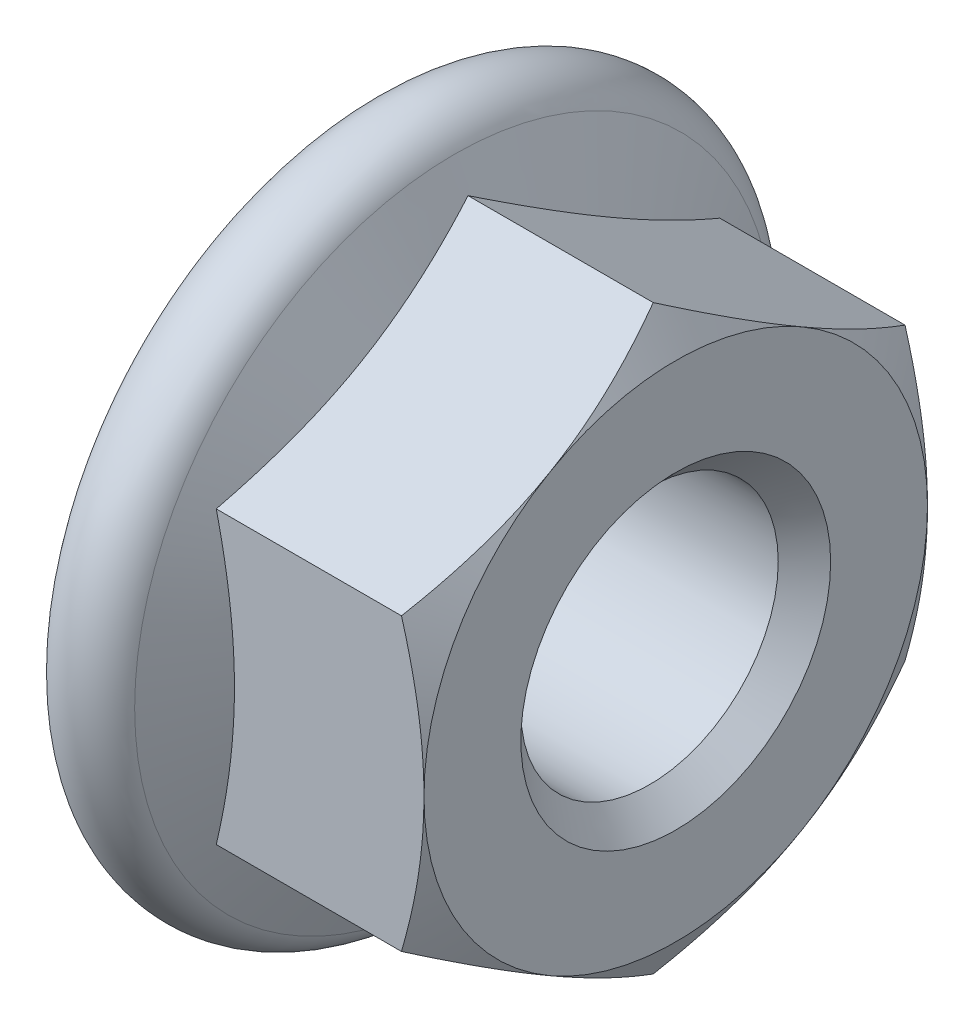
ISO-10303-21;
HEADER;
FILE_DESCRIPTION(('STEP AP214'),'2;1');
FILE_NAME('part.step','',(''),(''),'','','');
FILE_SCHEMA(('AUTOMOTIVE_DESIGN { 1 0 10303 214 1 1 1 1 }'));
ENDSEC;
DATA;
#1=APPLICATION_CONTEXT('core data for automotive mechanical design processes');
#2=APPLICATION_PROTOCOL_DEFINITION('international standard','automotive_design',2000,#1);
#3=PRODUCT_CONTEXT('',#1,'mechanical');
#4=PRODUCT('Part','Part','',(#3));
#5=PRODUCT_RELATED_PRODUCT_CATEGORY('part','',(#4));
#6=PRODUCT_DEFINITION_FORMATION('','',#4);
#7=PRODUCT_DEFINITION_CONTEXT('part definition',#1,'design');
#8=PRODUCT_DEFINITION('design','',#6,#7);
#9=PRODUCT_DEFINITION_SHAPE('','',#8);
#10=(LENGTH_UNIT() NAMED_UNIT(*) SI_UNIT(.MILLI.,.METRE.));
#11=(NAMED_UNIT(*) PLANE_ANGLE_UNIT() SI_UNIT($,.RADIAN.));
#12=(NAMED_UNIT(*) SI_UNIT($,.STERADIAN.) SOLID_ANGLE_UNIT());
#13=UNCERTAINTY_MEASURE_WITH_UNIT(LENGTH_MEASURE(1.E-05),#10,'distance_accuracy_value','');
#14=(GEOMETRIC_REPRESENTATION_CONTEXT(3) GLOBAL_UNCERTAINTY_ASSIGNED_CONTEXT((#13)) GLOBAL_UNIT_ASSIGNED_CONTEXT((#10,
#11,#12)) REPRESENTATION_CONTEXT('',''));
#15=CARTESIAN_POINT('',(0.,0.,0.));
#16=DIRECTION('',(0.,0.,1.));
#17=DIRECTION('',(1.,0.,0.));
#18=AXIS2_PLACEMENT_3D('',#15,#16,#17);
#19=CARTESIAN_POINT('',(7.6617088266467,0.,0.));
#20=DIRECTION('',(1.,0.,0.));
#21=DIRECTION('',(0.,0.,1.));
#22=AXIS2_PLACEMENT_3D('',#19,#20,#21);
#23=CONICAL_SURFACE('',#22,3.6617911733533,0.785398163397448);
#24=CARTESIAN_POINT('',(8.,0.,0.));
#25=DIRECTION('',(1.,0.,0.));
#26=DIRECTION('',(0.,0.,1.));
#27=AXIS2_PLACEMENT_3D('',#24,#25,#26);
#28=CIRCLE('',#27,4.00008234670659);
#29=CARTESIAN_POINT('',(8.,0.,-4.00008234670659));
#30=VERTEX_POINT('',#29);
#31=EDGE_CURVE('E11',#30,#30,#28,.T.);
#32=ORIENTED_EDGE('',*,*,#31,.T.);
#33=DIRECTION('',(-0.707106781186548,0.,0.707106781186547));
#34=VECTOR('',#33,1.);
#35=CARTESIAN_POINT('',(7.6617088266467,0.,-3.6617911733533));
#36=LINE('',#35,#34);
#37=CARTESIAN_POINT('',(7.32341765329341,0.,-3.3235));
#38=VERTEX_POINT('',#37);
#39=EDGE_CURVE('E26',#30,#38,#36,.T.);
#40=ORIENTED_EDGE('',*,*,#39,.T.);
#41=CARTESIAN_POINT('',(7.32341765329341,0.,0.));
#42=DIRECTION('',(-1.,0.,0.));
#43=DIRECTION('',(0.,0.,1.));
#44=AXIS2_PLACEMENT_3D('',#41,#42,#43);
#45=CIRCLE('',#44,3.3235);
#46=EDGE_CURVE('E47',#38,#38,#45,.T.);
#47=ORIENTED_EDGE('',*,*,#46,.T.);
#48=ORIENTED_EDGE('',*,*,#39,.F.);
#49=EDGE_LOOP('',(#32,#40,#47,#48));
#50=FACE_BOUND('',#49,.T.);
#51=ADVANCED_FACE('F16',(#50),#23,.F.);
#52=CARTESIAN_POINT('',(26.5484462822215,0.,0.));
#53=DIRECTION('',(-1.,0.,0.));
#54=DIRECTION('',(0.,0.,1.));
#55=AXIS2_PLACEMENT_3D('',#52,#53,#54);
#56=CYLINDRICAL_SURFACE('',#55,3.3235);
#57=CARTESIAN_POINT('',(0.390625,0.,0.));
#58=DIRECTION('',(1.,0.,0.));
#59=DIRECTION('',(0.,0.,-1.));
#60=AXIS2_PLACEMENT_3D('',#57,#58,#59);
#61=CIRCLE('',#60,3.3235);
#62=CARTESIAN_POINT('',(0.390625,0.,3.3235));
#63=VERTEX_POINT('',#62);
#64=CARTESIAN_POINT('',(0.390625,0.,-3.3235));
#65=VERTEX_POINT('',#64);
#66=EDGE_CURVE('E201',#63,#65,#61,.T.);
#67=ORIENTED_EDGE('',*,*,#66,.F.);
#68=CARTESIAN_POINT('',(0.390625,0.,0.));
#69=DIRECTION('',(1.,0.,0.));
#70=DIRECTION('',(0.,0.,-1.));
#71=AXIS2_PLACEMENT_3D('',#68,#69,#70);
#72=CIRCLE('',#71,3.3235);
#73=EDGE_CURVE('E209',#65,#63,#72,.T.);
#74=ORIENTED_EDGE('',*,*,#73,.F.);
#75=DIRECTION('',(1.,0.,0.));
#76=VECTOR('',#75,1.);
#77=CARTESIAN_POINT('',(26.5484462822215,0.,-3.3235));
#78=LINE('',#77,#76);
#79=EDGE_CURVE('E273',#65,#38,#78,.T.);
#80=ORIENTED_EDGE('',*,*,#79,.T.);
#81=ORIENTED_EDGE('',*,*,#46,.F.);
#82=ORIENTED_EDGE('',*,*,#79,.F.);
#83=EDGE_LOOP('',(#67,#74,#80,#81,#82));
#84=FACE_BOUND('',#83,.T.);
#85=ADVANCED_FACE('F461',(#84),#56,.F.);
#86=CARTESIAN_POINT('',(8.,0.,0.));
#87=DIRECTION('',(1.,0.,0.));
#88=DIRECTION('',(0.,1.,0.));
#89=AXIS2_PLACEMENT_3D('',#86,#87,#88);
#90=PLANE('',#89);
#91=CARTESIAN_POINT('',(8.,0.,0.));
#92=DIRECTION('',(1.,0.,0.));
#93=DIRECTION('',(0.,1.,0.));
#94=AXIS2_PLACEMENT_3D('',#91,#92,#93);
#95=CIRCLE('',#94,6.5);
#96=CARTESIAN_POINT('',(8.,-5.62916512459885,-3.25));
#97=VERTEX_POINT('',#96);
#98=CARTESIAN_POINT('',(8.,0.,-6.5));
#99=VERTEX_POINT('',#98);
#100=EDGE_CURVE('E279',#97,#99,#95,.T.);
#101=ORIENTED_EDGE('',*,*,#100,.T.);
#102=CARTESIAN_POINT('',(8.,0.,0.));
#103=DIRECTION('',(1.,0.,0.));
#104=DIRECTION('',(0.,1.,0.));
#105=AXIS2_PLACEMENT_3D('',#102,#103,#104);
#106=CIRCLE('',#105,6.5);
#107=CARTESIAN_POINT('',(8.,5.62916512459885,-3.25));
#108=VERTEX_POINT('',#107);
#109=EDGE_CURVE('E282',#99,#108,#106,.T.);
#110=ORIENTED_EDGE('',*,*,#109,.T.);
#111=CARTESIAN_POINT('',(8.,0.,0.));
#112=DIRECTION('',(1.,0.,0.));
#113=DIRECTION('',(0.,1.,0.));
#114=AXIS2_PLACEMENT_3D('',#111,#112,#113);
#115=CIRCLE('',#114,6.5);
#116=CARTESIAN_POINT('',(8.,5.62916512459886,3.25));
#117=VERTEX_POINT('',#116);
#118=EDGE_CURVE('E154',#108,#117,#115,.T.);
#119=ORIENTED_EDGE('',*,*,#118,.T.);
#120=CARTESIAN_POINT('',(8.,0.,0.));
#121=DIRECTION('',(1.,0.,0.));
#122=DIRECTION('',(0.,1.,0.));
#123=AXIS2_PLACEMENT_3D('',#120,#121,#122);
#124=CIRCLE('',#123,6.5);
#125=CARTESIAN_POINT('',(8.,0.,6.5));
#126=VERTEX_POINT('',#125);
#127=EDGE_CURVE('E283',#117,#126,#124,.T.);
#128=ORIENTED_EDGE('',*,*,#127,.T.);
#129=CARTESIAN_POINT('',(8.,0.,0.));
#130=DIRECTION('',(1.,0.,0.));
#131=DIRECTION('',(0.,1.,0.));
#132=AXIS2_PLACEMENT_3D('',#129,#130,#131);
#133=CIRCLE('',#132,6.5);
#134=CARTESIAN_POINT('',(8.,-5.62916512459885,3.25));
#135=VERTEX_POINT('',#134);
#136=EDGE_CURVE('E20',#126,#135,#133,.T.);
#137=ORIENTED_EDGE('',*,*,#136,.T.);
#138=CARTESIAN_POINT('',(8.,0.,0.));
#139=DIRECTION('',(1.,0.,0.));
#140=DIRECTION('',(0.,1.,0.));
#141=AXIS2_PLACEMENT_3D('',#138,#139,#140);
#142=CIRCLE('',#141,6.5);
#143=EDGE_CURVE('E327',#135,#97,#142,.T.);
#144=ORIENTED_EDGE('',*,*,#143,.T.);
#145=EDGE_LOOP('',(#101,#110,#119,#128,#137,#144));
#146=FACE_BOUND('',#145,.T.);
#147=ORIENTED_EDGE('',*,*,#31,.F.);
#148=EDGE_LOOP('',(#147));
#149=FACE_BOUND('',#148,.T.);
#150=ADVANCED_FACE('F463',(#146,#149),#90,.T.);
#151=CARTESIAN_POINT('',(0.1953125,0.,0.));
#152=DIRECTION('',(-1.,0.,0.));
#153=DIRECTION('',(0.,0.,-1.));
#154=AXIS2_PLACEMENT_3D('',#151,#152,#153);
#155=CONICAL_SURFACE('',#154,3.6617911733533,1.0471975511966);
#156=CARTESIAN_POINT('',(0.,0.,0.));
#157=DIRECTION('',(-1.,0.,0.));
#158=DIRECTION('',(0.,0.,-1.));
#159=AXIS2_PLACEMENT_3D('',#156,#157,#158);
#160=CIRCLE('',#159,4.00008234670659);
#161=CARTESIAN_POINT('',(0.,0.,4.00008234670659));
#162=VERTEX_POINT('',#161);
#163=EDGE_CURVE('E331',#162,#162,#160,.T.);
#164=ORIENTED_EDGE('',*,*,#163,.T.);
#165=DIRECTION('',(0.5,0.,-0.866025403784439));
#166=VECTOR('',#165,1.);
#167=CARTESIAN_POINT('',(0.1953125,0.,3.6617911733533));
#168=LINE('',#167,#166);
#169=EDGE_CURVE('E208',#162,#63,#168,.T.);
#170=ORIENTED_EDGE('',*,*,#169,.T.);
#171=ORIENTED_EDGE('',*,*,#66,.T.);
#172=ORIENTED_EDGE('',*,*,#73,.T.);
#173=ORIENTED_EDGE('',*,*,#169,.F.);
#174=EDGE_LOOP('',(#164,#170,#171,#172,#173));
#175=FACE_BOUND('',#174,.T.);
#176=ADVANCED_FACE('F456',(#175),#155,.F.);
#177=CARTESIAN_POINT('',(0.,3.875,0.));
#178=DIRECTION('',(-1.,0.,0.));
#179=DIRECTION('',(0.,0.,1.));
#180=AXIS2_PLACEMENT_3D('',#177,#178,#179);
#181=PLANE('',#180);
#182=CARTESIAN_POINT('',(0.,0.,0.));
#183=DIRECTION('',(1.,0.,0.));
#184=DIRECTION('',(0.,1.,0.));
#185=AXIS2_PLACEMENT_3D('',#182,#183,#184);
#186=CIRCLE('',#185,7.75);
#187=CARTESIAN_POINT('',(0.,7.75,0.));
#188=VERTEX_POINT('',#187);
#189=CARTESIAN_POINT('',(0.,0.,7.75));
#190=VERTEX_POINT('',#189);
#191=EDGE_CURVE('E199',#188,#190,#186,.T.);
#192=ORIENTED_EDGE('',*,*,#191,.F.);
#193=CARTESIAN_POINT('',(0.,0.,0.));
#194=DIRECTION('',(1.,0.,0.));
#195=DIRECTION('',(0.,1.,0.));
#196=AXIS2_PLACEMENT_3D('',#193,#194,#195);
#197=CIRCLE('',#196,7.75);
#198=EDGE_CURVE('E374',#190,#188,#197,.T.);
#199=ORIENTED_EDGE('',*,*,#198,.F.);
#200=EDGE_LOOP('',(#192,#199));
#201=FACE_BOUND('',#200,.T.);
#202=ORIENTED_EDGE('',*,*,#163,.F.);
#203=EDGE_LOOP('',(#202));
#204=FACE_BOUND('',#203,.T.);
#205=ADVANCED_FACE('F452',(#201,#204),#181,.T.);
#206=CARTESIAN_POINT('',(7.70972170819962,0.,0.));
#207=DIRECTION('',(-1.,0.,0.));
#208=DIRECTION('',(0.,1.,0.));
#209=AXIS2_PLACEMENT_3D('',#206,#207,#208);
#210=CONICAL_SURFACE('',#209,7.00277674973257,1.0471975511966);
#211=CARTESIAN_POINT('',(8.,0.,-6.5));
#212=CARTESIAN_POINT('',(8.,-1.7416697508023,-6.5));
#213=CARTESIAN_POINT('',(7.41944341639923,-3.75277674973257,-6.5));
#214=(BOUNDED_CURVE() B_SPLINE_CURVE(2,(#211,#212,#213),.UNSPECIFIED.,.F.,
.F.) B_SPLINE_CURVE_WITH_KNOTS((3,3),(0.380711317203908,0.761422634407816),
.UNSPECIFIED.) CURVE() GEOMETRIC_REPRESENTATION_ITEM() RATIONAL_B_SPLINE_CURVE((1.,
1.03795484930202,1.)) REPRESENTATION_ITEM(''));
#215=CARTESIAN_POINT('',(7.41944341639923,-3.75277674973257,-6.5));
#216=VERTEX_POINT('',#215);
#217=EDGE_CURVE('E187',#99,#216,#214,.T.);
#218=ORIENTED_EDGE('',*,*,#217,.F.);
#219=ORIENTED_EDGE('',*,*,#100,.F.);
#220=CARTESIAN_POINT('',(7.41944341639923,-3.75277674973257,-6.5));
#221=CARTESIAN_POINT('',(8.,-4.75833024919772,-4.75833024919771));
#222=CARTESIAN_POINT('',(8.,-5.62916512459885,-3.25));
#223=(BOUNDED_CURVE() B_SPLINE_CURVE(2,(#220,#221,#222),.UNSPECIFIED.,.F.,
.F.) B_SPLINE_CURVE_WITH_KNOTS((3,3),(0.,0.380711317203909),
.UNSPECIFIED.) CURVE() GEOMETRIC_REPRESENTATION_ITEM() RATIONAL_B_SPLINE_CURVE((1.,
1.03795484930205,1.)) REPRESENTATION_ITEM(''));
#224=EDGE_CURVE('E256',#216,#97,#223,.T.);
#225=ORIENTED_EDGE('',*,*,#224,.F.);
#226=EDGE_LOOP('',(#218,#219,#225));
#227=FACE_BOUND('',#226,.T.);
#228=ADVANCED_FACE('F455',(#227),#210,.T.);
#229=CARTESIAN_POINT('',(7.70972170819962,0.,0.));
#230=DIRECTION('',(-1.,0.,0.));
#231=DIRECTION('',(0.,-1.,0.));
#232=AXIS2_PLACEMENT_3D('',#229,#230,#231);
#233=CONICAL_SURFACE('',#232,7.00277674973257,1.0471975511966);
#234=CARTESIAN_POINT('',(7.41944341639923,-7.50555349946513,0.));
#235=CARTESIAN_POINT('',(8.,-6.5,1.74166975080232));
#236=CARTESIAN_POINT('',(8.,-5.62916512459885,3.25));
#237=(BOUNDED_CURVE() B_SPLINE_CURVE(2,(#234,#235,#236),.UNSPECIFIED.,.F.,
.F.) B_SPLINE_CURVE_WITH_KNOTS((3,3),(0.,0.380711317203908),
.UNSPECIFIED.) CURVE() GEOMETRIC_REPRESENTATION_ITEM() RATIONAL_B_SPLINE_CURVE((1.,
1.03795484930205,1.)) REPRESENTATION_ITEM(''));
#238=CARTESIAN_POINT('',(7.41944341639923,-7.50555349946513,0.));
#239=VERTEX_POINT('',#238);
#240=EDGE_CURVE('E362',#239,#135,#237,.T.);
#241=ORIENTED_EDGE('',*,*,#240,.F.);
#242=CARTESIAN_POINT('',(8.,-5.62916512459885,-3.25));
#243=CARTESIAN_POINT('',(8.,-6.50000000000001,-1.74166975080229));
#244=CARTESIAN_POINT('',(7.41944341639923,-7.50555349946514,0.));
#245=(BOUNDED_CURVE() B_SPLINE_CURVE(2,(#242,#243,#244),.UNSPECIFIED.,.F.,
.F.) B_SPLINE_CURVE_WITH_KNOTS((3,3),(0.380711317203909,0.761422634407818),
.UNSPECIFIED.) CURVE() GEOMETRIC_REPRESENTATION_ITEM() RATIONAL_B_SPLINE_CURVE((1.,
1.03795484930203,1.)) REPRESENTATION_ITEM(''));
#246=EDGE_CURVE('E317',#97,#239,#245,.T.);
#247=ORIENTED_EDGE('',*,*,#246,.F.);
#248=ORIENTED_EDGE('',*,*,#143,.F.);
#249=EDGE_LOOP('',(#241,#247,#248));
#250=FACE_BOUND('',#249,.T.);
#251=ADVANCED_FACE('F18',(#250),#233,.T.);
#252=CARTESIAN_POINT('',(7.70972170819962,0.,0.));
#253=DIRECTION('',(-1.,0.,0.));
#254=DIRECTION('',(0.,1.,0.));
#255=AXIS2_PLACEMENT_3D('',#252,#253,#254);
#256=CONICAL_SURFACE('',#255,7.00277674973257,1.0471975511966);
#257=CARTESIAN_POINT('',(8.,5.62916512459885,-3.25));
#258=CARTESIAN_POINT('',(8.,4.7583302491977,-4.7583302491977));
#259=CARTESIAN_POINT('',(7.41944341639923,3.75277674973257,-6.5));
#260=(BOUNDED_CURVE() B_SPLINE_CURVE(2,(#257,#258,#259),.UNSPECIFIED.,.F.,
.F.) B_SPLINE_CURVE_WITH_KNOTS((3,3),(0.380711317203908,0.761422634407815),
.UNSPECIFIED.) CURVE() GEOMETRIC_REPRESENTATION_ITEM() RATIONAL_B_SPLINE_CURVE((1.,
1.03795484930204,1.)) REPRESENTATION_ITEM(''));
#261=CARTESIAN_POINT('',(7.41944341639923,3.75277674973257,-6.5));
#262=VERTEX_POINT('',#261);
#263=EDGE_CURVE('E161',#108,#262,#260,.T.);
#264=ORIENTED_EDGE('',*,*,#263,.F.);
#265=ORIENTED_EDGE('',*,*,#109,.F.);
#266=CARTESIAN_POINT('',(7.41944341639923,3.75277674973257,-6.5));
#267=CARTESIAN_POINT('',(8.,1.7416697508023,-6.5));
#268=CARTESIAN_POINT('',(8.,0.,-6.5));
#269=(BOUNDED_CURVE() B_SPLINE_CURVE(2,(#266,#267,#268),.UNSPECIFIED.,.F.,
.F.) B_SPLINE_CURVE_WITH_KNOTS((3,3),(0.,0.380711317203908),
.UNSPECIFIED.) CURVE() GEOMETRIC_REPRESENTATION_ITEM() RATIONAL_B_SPLINE_CURVE((1.,
1.03795484930202,1.)) REPRESENTATION_ITEM(''));
#270=EDGE_CURVE('E178',#262,#99,#269,.T.);
#271=ORIENTED_EDGE('',*,*,#270,.F.);
#272=EDGE_LOOP('',(#264,#265,#271));
#273=FACE_BOUND('',#272,.T.);
#274=ADVANCED_FACE('F487',(#273),#256,.T.);
#275=CARTESIAN_POINT('',(7.70972170819962,0.,0.));
#276=DIRECTION('',(-1.,0.,0.));
#277=DIRECTION('',(0.,1.,0.));
#278=AXIS2_PLACEMENT_3D('',#275,#276,#277);
#279=CONICAL_SURFACE('',#278,7.00277674973257,1.0471975511966);
#280=CARTESIAN_POINT('',(7.41944341639923,-3.75277674973256,6.5));
#281=CARTESIAN_POINT('',(8.,-1.74166975080229,6.50000000000001));
#282=CARTESIAN_POINT('',(8.,0.,6.5));
#283=(BOUNDED_CURVE() B_SPLINE_CURVE(2,(#280,#281,#282),.UNSPECIFIED.,.F.,
.F.) B_SPLINE_CURVE_WITH_KNOTS((3,3),(0.,0.380711317203908),
.UNSPECIFIED.) CURVE() GEOMETRIC_REPRESENTATION_ITEM() RATIONAL_B_SPLINE_CURVE((1.,
1.03795484930204,1.)) REPRESENTATION_ITEM(''));
#284=CARTESIAN_POINT('',(7.41944341639923,-3.75277674973255,6.5));
#285=VERTEX_POINT('',#284);
#286=EDGE_CURVE('E210',#285,#126,#283,.T.);
#287=ORIENTED_EDGE('',*,*,#286,.F.);
#288=CARTESIAN_POINT('',(8.,-5.62916512459885,3.25));
#289=CARTESIAN_POINT('',(8.,-4.7583302491977,4.7583302491977));
#290=CARTESIAN_POINT('',(7.41944341639923,-3.75277674973256,6.5));
#291=(BOUNDED_CURVE() B_SPLINE_CURVE(2,(#288,#289,#290),.UNSPECIFIED.,.F.,
.F.) B_SPLINE_CURVE_WITH_KNOTS((3,3),(0.380711317203908,0.761422634407816),
.UNSPECIFIED.) CURVE() GEOMETRIC_REPRESENTATION_ITEM() RATIONAL_B_SPLINE_CURVE((1.,
1.03795484930204,1.)) REPRESENTATION_ITEM(''));
#292=EDGE_CURVE('E216',#135,#285,#291,.T.);
#293=ORIENTED_EDGE('',*,*,#292,.F.);
#294=ORIENTED_EDGE('',*,*,#136,.F.);
#295=EDGE_LOOP('',(#287,#293,#294));
#296=FACE_BOUND('',#295,.T.);
#297=ADVANCED_FACE('F489',(#296),#279,.T.);
#298=CARTESIAN_POINT('',(7.70972170819962,0.,0.));
#299=DIRECTION('',(-1.,0.,0.));
#300=DIRECTION('',(0.,1.,0.));
#301=AXIS2_PLACEMENT_3D('',#298,#299,#300);
#302=CONICAL_SURFACE('',#301,7.00277674973257,1.0471975511966);
#303=CARTESIAN_POINT('',(8.,5.62916512459886,3.25));
#304=CARTESIAN_POINT('',(8.,6.50000000000002,1.74166975080229));
#305=CARTESIAN_POINT('',(7.41944341639923,7.50555349946514,0.));
#306=(BOUNDED_CURVE() B_SPLINE_CURVE(2,(#303,#304,#305),.UNSPECIFIED.,.F.,
.F.) B_SPLINE_CURVE_WITH_KNOTS((3,3),(0.380711317203908,0.761422634407816),
.UNSPECIFIED.) CURVE() GEOMETRIC_REPRESENTATION_ITEM() RATIONAL_B_SPLINE_CURVE((1.,
1.03795484930203,1.)) REPRESENTATION_ITEM(''));
#307=CARTESIAN_POINT('',(7.41944341639923,7.50555349946513,0.));
#308=VERTEX_POINT('',#307);
#309=EDGE_CURVE('E151',#117,#308,#306,.T.);
#310=ORIENTED_EDGE('',*,*,#309,.F.);
#311=ORIENTED_EDGE('',*,*,#118,.F.);
#312=CARTESIAN_POINT('',(7.41944341639923,7.50555349946513,0.));
#313=CARTESIAN_POINT('',(8.,6.50000000000001,-1.7416697508023));
#314=CARTESIAN_POINT('',(8.,5.62916512459885,-3.25));
#315=(BOUNDED_CURVE() B_SPLINE_CURVE(2,(#312,#313,#314),.UNSPECIFIED.,.F.,
.F.) B_SPLINE_CURVE_WITH_KNOTS((3,3),(0.,0.380711317203908),
.UNSPECIFIED.) CURVE() GEOMETRIC_REPRESENTATION_ITEM() RATIONAL_B_SPLINE_CURVE((1.,
1.03795484930203,1.)) REPRESENTATION_ITEM(''));
#316=EDGE_CURVE('E148',#308,#108,#315,.T.);
#317=ORIENTED_EDGE('',*,*,#316,.F.);
#318=EDGE_LOOP('',(#310,#311,#317));
#319=FACE_BOUND('',#318,.T.);
#320=ADVANCED_FACE('F150',(#319),#302,.T.);
#321=CARTESIAN_POINT('',(7.70972170819962,0.,0.));
#322=DIRECTION('',(-1.,0.,0.));
#323=DIRECTION('',(0.,1.,0.));
#324=AXIS2_PLACEMENT_3D('',#321,#322,#323);
#325=CONICAL_SURFACE('',#324,7.00277674973257,1.0471975511966);
#326=CARTESIAN_POINT('',(7.41944341639923,3.75277674973258,6.5));
#327=CARTESIAN_POINT('',(8.,4.75833024919772,4.75833024919771));
#328=CARTESIAN_POINT('',(8.,5.62916512459886,3.25));
#329=(BOUNDED_CURVE() B_SPLINE_CURVE(2,(#326,#327,#328),.UNSPECIFIED.,.F.,
.F.) B_SPLINE_CURVE_WITH_KNOTS((3,3),(0.,0.380711317203908),
.UNSPECIFIED.) CURVE() GEOMETRIC_REPRESENTATION_ITEM() RATIONAL_B_SPLINE_CURVE((1.,
1.03795484930205,1.)) REPRESENTATION_ITEM(''));
#330=CARTESIAN_POINT('',(7.41944341639923,3.75277674973257,6.5));
#331=VERTEX_POINT('',#330);
#332=EDGE_CURVE('E171',#331,#117,#329,.T.);
#333=ORIENTED_EDGE('',*,*,#332,.F.);
#334=CARTESIAN_POINT('',(8.,0.,6.5));
#335=CARTESIAN_POINT('',(8.,1.74166975080231,6.50000000000001));
#336=CARTESIAN_POINT('',(7.41944341639923,3.75277674973257,6.5));
#337=(BOUNDED_CURVE() B_SPLINE_CURVE(2,(#334,#335,#336),.UNSPECIFIED.,.F.,
.F.) B_SPLINE_CURVE_WITH_KNOTS((3,3),(0.380711317203908,0.761422634407815),
.UNSPECIFIED.) CURVE() GEOMETRIC_REPRESENTATION_ITEM() RATIONAL_B_SPLINE_CURVE((1.,
1.03795484930205,1.)) REPRESENTATION_ITEM(''));
#338=EDGE_CURVE('E240',#126,#331,#337,.T.);
#339=ORIENTED_EDGE('',*,*,#338,.F.);
#340=ORIENTED_EDGE('',*,*,#127,.F.);
#341=EDGE_LOOP('',(#333,#339,#340));
#342=FACE_BOUND('',#341,.T.);
#343=ADVANCED_FACE('F495',(#342),#325,.T.);
#344=CARTESIAN_POINT('',(0.,3.75277674973257,6.5));
#345=DIRECTION('',(0.,0.866025403784439,0.5));
#346=DIRECTION('',(1.,0.,0.));
#347=AXIS2_PLACEMENT_3D('',#344,#345,#346);
#348=PLANE('',#347);
#349=ORIENTED_EDGE('',*,*,#332,.T.);
#350=ORIENTED_EDGE('',*,*,#309,.T.);
#351=DIRECTION('',(1.,0.,0.));
#352=VECTOR('',#351,1.);
#353=CARTESIAN_POINT('',(0.,7.50555349946513,0.));
#354=LINE('',#353,#352);
#355=CARTESIAN_POINT('',(2.63804077796359,7.50555349946513,0.));
#356=VERTEX_POINT('',#355);
#357=EDGE_CURVE('E167',#356,#308,#354,.T.);
#358=ORIENTED_EDGE('',*,*,#357,.F.);
#359=CARTESIAN_POINT('',(3.10693807544874,5.62916512459886,3.25));
#360=CARTESIAN_POINT('',(3.10693807544874,6.5,1.74166975080229));
#361=CARTESIAN_POINT('',(2.63804077796359,7.50555349946513,0.));
#362=(BOUNDED_CURVE() B_SPLINE_CURVE(2,(#359,#360,#361),.UNSPECIFIED.,.F.,
.F.) B_SPLINE_CURVE_WITH_KNOTS((3,3),(0.517084252643647,0.912820547157443),
.UNSPECIFIED.) CURVE() GEOMETRIC_REPRESENTATION_ITEM() RATIONAL_B_SPLINE_CURVE((1.,
1.05008356557604,1.0235069561196)) REPRESENTATION_ITEM(''));
#363=CARTESIAN_POINT('',(3.10693807544874,5.62916512459886,3.25));
#364=VERTEX_POINT('',#363);
#365=EDGE_CURVE('E301',#364,#356,#362,.T.);
#366=ORIENTED_EDGE('',*,*,#365,.F.);
#367=CARTESIAN_POINT('',(2.63804077796359,3.75277674973258,6.5));
#368=CARTESIAN_POINT('',(3.10693807544874,4.75833024919771,4.7583302491977));
#369=CARTESIAN_POINT('',(3.10693807544874,5.62916512459886,3.25));
#370=(BOUNDED_CURVE() B_SPLINE_CURVE(2,(#367,#368,#369),.UNSPECIFIED.,.F.,
.F.) B_SPLINE_CURVE_WITH_KNOTS((3,3),(0.12134795812985,0.517084252643647),
.UNSPECIFIED.) CURVE() GEOMETRIC_REPRESENTATION_ITEM() RATIONAL_B_SPLINE_CURVE((1.0235069561196,
1.05008356557604,1.)) REPRESENTATION_ITEM(''));
#371=CARTESIAN_POINT('',(2.63804077796359,3.75277674973258,6.5));
#372=VERTEX_POINT('',#371);
#373=EDGE_CURVE('E226',#372,#364,#370,.T.);
#374=ORIENTED_EDGE('',*,*,#373,.F.);
#375=DIRECTION('',(1.,0.,0.));
#376=VECTOR('',#375,1.);
#377=CARTESIAN_POINT('',(0.,3.75277674973257,6.5));
#378=LINE('',#377,#376);
#379=EDGE_CURVE('E160',#372,#331,#378,.T.);
#380=ORIENTED_EDGE('',*,*,#379,.T.);
#381=EDGE_LOOP('',(#349,#350,#358,#366,#374,#380));
#382=FACE_BOUND('',#381,.T.);
#383=ADVANCED_FACE('F166',(#382),#348,.T.);
#384=CARTESIAN_POINT('',(0.,7.50555349946513,0.));
#385=DIRECTION('',(0.,0.866025403784439,-0.5));
#386=DIRECTION('',(-1.,0.,0.));
#387=AXIS2_PLACEMENT_3D('',#384,#385,#386);
#388=PLANE('',#387);
#389=ORIENTED_EDGE('',*,*,#316,.T.);
#390=ORIENTED_EDGE('',*,*,#263,.T.);
#391=DIRECTION('',(1.,0.,0.));
#392=VECTOR('',#391,1.);
#393=CARTESIAN_POINT('',(0.,3.75277674973257,-6.5));
#394=LINE('',#393,#392);
#395=CARTESIAN_POINT('',(2.63804077796359,3.75277674973257,-6.5));
#396=VERTEX_POINT('',#395);
#397=EDGE_CURVE('E233',#396,#262,#394,.T.);
#398=ORIENTED_EDGE('',*,*,#397,.F.);
#399=CARTESIAN_POINT('',(3.10693807544874,5.62916512459885,-3.25));
#400=CARTESIAN_POINT('',(3.10693807544874,4.75833024919771,-4.7583302491977));
#401=CARTESIAN_POINT('',(2.63804077796359,3.75277674973257,-6.5));
#402=(BOUNDED_CURVE() B_SPLINE_CURVE(2,(#399,#400,#401),.UNSPECIFIED.,.F.,
.F.) B_SPLINE_CURVE_WITH_KNOTS((3,3),(0.517084252643646,0.912820547157444),
.UNSPECIFIED.) CURVE() GEOMETRIC_REPRESENTATION_ITEM() RATIONAL_B_SPLINE_CURVE((1.,
1.05008356557604,1.0235069561196)) REPRESENTATION_ITEM(''));
#403=CARTESIAN_POINT('',(3.10693807544874,5.62916512459885,-3.25));
#404=VERTEX_POINT('',#403);
#405=EDGE_CURVE('E249',#404,#396,#402,.T.);
#406=ORIENTED_EDGE('',*,*,#405,.F.);
#407=CARTESIAN_POINT('',(2.63804077796359,7.50555349946513,0.));
#408=CARTESIAN_POINT('',(3.10693807544874,6.5,-1.7416697508023));
#409=CARTESIAN_POINT('',(3.10693807544874,5.62916512459885,-3.25));
#410=(BOUNDED_CURVE() B_SPLINE_CURVE(2,(#407,#408,#409),.UNSPECIFIED.,.F.,
.F.) B_SPLINE_CURVE_WITH_KNOTS((3,3),(0.121347958129849,0.517084252643646),
.UNSPECIFIED.) CURVE() GEOMETRIC_REPRESENTATION_ITEM() RATIONAL_B_SPLINE_CURVE((1.0235069561196,
1.05008356557605,1.)) REPRESENTATION_ITEM(''));
#411=EDGE_CURVE('E176',#356,#404,#410,.T.);
#412=ORIENTED_EDGE('',*,*,#411,.F.);
#413=ORIENTED_EDGE('',*,*,#357,.T.);
#414=EDGE_LOOP('',(#389,#390,#398,#406,#412,#413));
#415=FACE_BOUND('',#414,.T.);
#416=ADVANCED_FACE('F174',(#415),#388,.T.);
#417=CARTESIAN_POINT('',(0.,3.75277674973257,-6.5));
#418=DIRECTION('',(0.,0.,-1.));
#419=DIRECTION('',(0.,-1.,0.));
#420=AXIS2_PLACEMENT_3D('',#417,#418,#419);
#421=PLANE('',#420);
#422=ORIENTED_EDGE('',*,*,#270,.T.);
#423=ORIENTED_EDGE('',*,*,#217,.T.);
#424=DIRECTION('',(1.,0.,0.));
#425=VECTOR('',#424,1.);
#426=CARTESIAN_POINT('',(0.,-3.75277674973257,-6.5));
#427=LINE('',#426,#425);
#428=CARTESIAN_POINT('',(2.63804077796359,-3.75277674973257,-6.5));
#429=VERTEX_POINT('',#428);
#430=EDGE_CURVE('E264',#429,#216,#427,.T.);
#431=ORIENTED_EDGE('',*,*,#430,.F.);
#432=CARTESIAN_POINT('',(3.10693807544874,0.,-6.5));
#433=CARTESIAN_POINT('',(3.10693807544874,-1.7416697508023,-6.5));
#434=CARTESIAN_POINT('',(2.63804077796359,-3.75277674973257,-6.5));
#435=(BOUNDED_CURVE() B_SPLINE_CURVE(2,(#432,#433,#434),.UNSPECIFIED.,.F.,
.F.) B_SPLINE_CURVE_WITH_KNOTS((3,3),(0.517084252643647,0.912820547157445),
.UNSPECIFIED.) CURVE() GEOMETRIC_REPRESENTATION_ITEM() RATIONAL_B_SPLINE_CURVE((1.,
1.05008356557605,1.0235069561196)) REPRESENTATION_ITEM(''));
#436=CARTESIAN_POINT('',(3.10693807544874,0.,-6.5));
#437=VERTEX_POINT('',#436);
#438=EDGE_CURVE('E383',#437,#429,#435,.T.);
#439=ORIENTED_EDGE('',*,*,#438,.F.);
#440=CARTESIAN_POINT('',(2.63804077796359,3.75277674973257,-6.5));
#441=CARTESIAN_POINT('',(3.10693807544874,1.7416697508023,-6.5));
#442=CARTESIAN_POINT('',(3.10693807544874,0.,-6.5));
#443=(BOUNDED_CURVE() B_SPLINE_CURVE(2,(#440,#441,#442),.UNSPECIFIED.,.F.,
.F.) B_SPLINE_CURVE_WITH_KNOTS((3,3),(0.121347958129849,0.517084252643647),
.UNSPECIFIED.) CURVE() GEOMETRIC_REPRESENTATION_ITEM() RATIONAL_B_SPLINE_CURVE((1.0235069561196,
1.05008356557605,1.)) REPRESENTATION_ITEM(''));
#444=EDGE_CURVE('E255',#396,#437,#443,.T.);
#445=ORIENTED_EDGE('',*,*,#444,.F.);
#446=ORIENTED_EDGE('',*,*,#397,.T.);
#447=EDGE_LOOP('',(#422,#423,#431,#439,#445,#446));
#448=FACE_BOUND('',#447,.T.);
#449=ADVANCED_FACE('F481',(#448),#421,.T.);
#450=CARTESIAN_POINT('',(0.,-3.75277674973256,6.5));
#451=DIRECTION('',(0.,0.,1.));
#452=DIRECTION('',(0.,-1.,0.));
#453=AXIS2_PLACEMENT_3D('',#450,#451,#452);
#454=PLANE('',#453);
#455=ORIENTED_EDGE('',*,*,#338,.T.);
#456=ORIENTED_EDGE('',*,*,#379,.F.);
#457=CARTESIAN_POINT('',(3.10693807544874,0.,6.5));
#458=CARTESIAN_POINT('',(3.10693807544874,1.74166975080231,6.5));
#459=CARTESIAN_POINT('',(2.63804077796359,3.75277674973258,6.5));
#460=(BOUNDED_CURVE() B_SPLINE_CURVE(2,(#457,#458,#459),.UNSPECIFIED.,.F.,
.F.) B_SPLINE_CURVE_WITH_KNOTS((3,3),(0.517084252643647,0.912820547157444),
.UNSPECIFIED.) CURVE() GEOMETRIC_REPRESENTATION_ITEM() RATIONAL_B_SPLINE_CURVE((1.,
1.05008356557605,1.02350695611961)) REPRESENTATION_ITEM(''));
#461=CARTESIAN_POINT('',(3.10693807544874,0.,6.5));
#462=VERTEX_POINT('',#461);
#463=EDGE_CURVE('E217',#462,#372,#460,.T.);
#464=ORIENTED_EDGE('',*,*,#463,.F.);
#465=CARTESIAN_POINT('',(2.63804077796359,-3.75277674973256,6.50000000000001));
#466=CARTESIAN_POINT('',(3.10693807544874,-1.74166975080228,6.50000000000001));
#467=CARTESIAN_POINT('',(3.10693807544874,0.,6.5));
#468=(BOUNDED_CURVE() B_SPLINE_CURVE(2,(#465,#466,#467),.UNSPECIFIED.,.F.,
.F.) B_SPLINE_CURVE_WITH_KNOTS((3,3),(0.121347958129849,0.517084252643647),
.UNSPECIFIED.) CURVE() GEOMETRIC_REPRESENTATION_ITEM() RATIONAL_B_SPLINE_CURVE((1.0235069561196,
1.05008356557605,1.)) REPRESENTATION_ITEM(''));
#469=CARTESIAN_POINT('',(2.63804077796359,-3.75277674973256,6.5));
#470=VERTEX_POINT('',#469);
#471=EDGE_CURVE('E225',#470,#462,#468,.T.);
#472=ORIENTED_EDGE('',*,*,#471,.F.);
#473=DIRECTION('',(1.,0.,0.));
#474=VECTOR('',#473,1.);
#475=CARTESIAN_POINT('',(0.,-3.75277674973256,6.5));
#476=LINE('',#475,#474);
#477=EDGE_CURVE('E191',#470,#285,#476,.T.);
#478=ORIENTED_EDGE('',*,*,#477,.T.);
#479=ORIENTED_EDGE('',*,*,#286,.T.);
#480=EDGE_LOOP('',(#455,#456,#464,#472,#478,#479));
#481=FACE_BOUND('',#480,.T.);
#482=ADVANCED_FACE('F477',(#481),#454,.T.);
#483=CARTESIAN_POINT('',(0.,-7.50555349946513,0.));
#484=DIRECTION('',(0.,-0.866025403784438,0.5));
#485=DIRECTION('',(-1.,0.,0.));
#486=AXIS2_PLACEMENT_3D('',#483,#484,#485);
#487=PLANE('',#486);
#488=ORIENTED_EDGE('',*,*,#292,.T.);
#489=ORIENTED_EDGE('',*,*,#477,.F.);
#490=CARTESIAN_POINT('',(3.10693807544874,-5.62916512459885,3.25));
#491=CARTESIAN_POINT('',(3.10693807544874,-4.75833024919769,4.75833024919772));
#492=CARTESIAN_POINT('',(2.63804077796359,-3.75277674973256,6.50000000000001));
#493=(BOUNDED_CURVE() B_SPLINE_CURVE(2,(#490,#491,#492),.UNSPECIFIED.,.F.,
.F.) B_SPLINE_CURVE_WITH_KNOTS((3,3),(0.517084252643647,0.912820547157444),
.UNSPECIFIED.) CURVE() GEOMETRIC_REPRESENTATION_ITEM() RATIONAL_B_SPLINE_CURVE((1.,
1.05008356557605,1.0235069561196)) REPRESENTATION_ITEM(''));
#494=CARTESIAN_POINT('',(3.10693807544874,-5.62916512459885,3.25));
#495=VERTEX_POINT('',#494);
#496=EDGE_CURVE('E289',#495,#470,#493,.T.);
#497=ORIENTED_EDGE('',*,*,#496,.F.);
#498=CARTESIAN_POINT('',(2.63804077796359,-7.50555349946514,0.));
#499=CARTESIAN_POINT('',(3.10693807544874,-6.5,1.74166975080231));
#500=CARTESIAN_POINT('',(3.10693807544874,-5.62916512459885,3.25));
#501=(BOUNDED_CURVE() B_SPLINE_CURVE(2,(#498,#499,#500),.UNSPECIFIED.,.F.,
.F.) B_SPLINE_CURVE_WITH_KNOTS((3,3),(0.121347958129849,0.517084252643647),
.UNSPECIFIED.) CURVE() GEOMETRIC_REPRESENTATION_ITEM() RATIONAL_B_SPLINE_CURVE((1.0235069561196,
1.05008356557605,1.)) REPRESENTATION_ITEM(''));
#502=CARTESIAN_POINT('',(2.63804077796359,-7.50555349946513,0.));
#503=VERTEX_POINT('',#502);
#504=EDGE_CURVE('E246',#503,#495,#501,.T.);
#505=ORIENTED_EDGE('',*,*,#504,.F.);
#506=DIRECTION('',(1.,0.,0.));
#507=VECTOR('',#506,1.);
#508=CARTESIAN_POINT('',(0.,-7.50555349946513,0.));
#509=LINE('',#508,#507);
#510=EDGE_CURVE('E391',#503,#239,#509,.T.);
#511=ORIENTED_EDGE('',*,*,#510,.T.);
#512=ORIENTED_EDGE('',*,*,#240,.T.);
#513=EDGE_LOOP('',(#488,#489,#497,#505,#511,#512));
#514=FACE_BOUND('',#513,.T.);
#515=ADVANCED_FACE('F480',(#514),#487,.T.);
#516=CARTESIAN_POINT('',(0.,-3.75277674973257,-6.5));
#517=DIRECTION('',(0.,-0.866025403784439,-0.5));
#518=DIRECTION('',(0.,0.5,-0.866025403784439));
#519=AXIS2_PLACEMENT_3D('',#516,#517,#518);
#520=PLANE('',#519);
#521=ORIENTED_EDGE('',*,*,#246,.T.);
#522=ORIENTED_EDGE('',*,*,#510,.F.);
#523=CARTESIAN_POINT('',(3.10693807544874,-5.62916512459885,-3.25));
#524=CARTESIAN_POINT('',(3.10693807544874,-6.5,-1.74166975080228));
#525=CARTESIAN_POINT('',(2.63804077796359,-7.50555349946513,0.));
#526=(BOUNDED_CURVE() B_SPLINE_CURVE(2,(#523,#524,#525),.UNSPECIFIED.,.F.,
.F.) B_SPLINE_CURVE_WITH_KNOTS((3,3),(0.517084252643647,0.912820547157446),
.UNSPECIFIED.) CURVE() GEOMETRIC_REPRESENTATION_ITEM() RATIONAL_B_SPLINE_CURVE((1.,
1.05008356557605,1.0235069561196)) REPRESENTATION_ITEM(''));
#527=CARTESIAN_POINT('',(3.10693807544874,-5.62916512459885,-3.25));
#528=VERTEX_POINT('',#527);
#529=EDGE_CURVE('E193',#528,#503,#526,.T.);
#530=ORIENTED_EDGE('',*,*,#529,.F.);
#531=CARTESIAN_POINT('',(2.63804077796359,-3.75277674973257,-6.5));
#532=CARTESIAN_POINT('',(3.10693807544874,-4.7583302491977,-4.7583302491977));
#533=CARTESIAN_POINT('',(3.10693807544874,-5.62916512459885,-3.25));
#534=(BOUNDED_CURVE() B_SPLINE_CURVE(2,(#531,#532,#533),.UNSPECIFIED.,.F.,
.F.) B_SPLINE_CURVE_WITH_KNOTS((3,3),(0.121347958129849,0.517084252643647),
.UNSPECIFIED.) CURVE() GEOMETRIC_REPRESENTATION_ITEM() RATIONAL_B_SPLINE_CURVE((1.0235069561196,
1.05008356557605,1.)) REPRESENTATION_ITEM(''));
#535=EDGE_CURVE('E398',#429,#528,#534,.T.);
#536=ORIENTED_EDGE('',*,*,#535,.F.);
#537=ORIENTED_EDGE('',*,*,#430,.T.);
#538=ORIENTED_EDGE('',*,*,#224,.T.);
#539=EDGE_LOOP('',(#521,#522,#530,#536,#537,#538));
#540=FACE_BOUND('',#539,.T.);
#541=ADVANCED_FACE('F486',(#540),#520,.T.);
#542=CARTESIAN_POINT('',(1.2,0.,0.));
#543=DIRECTION('',(1.,0.,0.));
#544=DIRECTION('',(0.,0.,-1.));
#545=AXIS2_PLACEMENT_3D('',#542,#543,#544);
#546=TOROIDAL_SURFACE('',#545,7.75,1.2);
#547=CARTESIAN_POINT('',(2.28756934444398,0.,0.));
#548=DIRECTION('',(1.,0.,0.));
#549=DIRECTION('',(0.,1.,0.));
#550=AXIS2_PLACEMENT_3D('',#547,#548,#549);
#551=CIRCLE('',#550,8.25714191408884);
#552=CARTESIAN_POINT('',(2.28756934444398,8.25714191408884,0.));
#553=VERTEX_POINT('',#552);
#554=CARTESIAN_POINT('',(2.28756934444398,0.,8.25714191408884));
#555=VERTEX_POINT('',#554);
#556=EDGE_CURVE('E245',#553,#555,#551,.T.);
#557=ORIENTED_EDGE('',*,*,#556,.F.);
#558=CARTESIAN_POINT('',(2.28756934444398,0.,0.));
#559=DIRECTION('',(1.,0.,0.));
#560=DIRECTION('',(0.,1.,0.));
#561=AXIS2_PLACEMENT_3D('',#558,#559,#560);
#562=CIRCLE('',#561,8.25714191408884);
#563=CARTESIAN_POINT('',(2.28756934444398,-8.25714191408884,0.));
#564=VERTEX_POINT('',#563);
#565=EDGE_CURVE('E321',#564,#553,#562,.T.);
#566=ORIENTED_EDGE('',*,*,#565,.F.);
#567=CARTESIAN_POINT('',(2.28756934444398,0.,0.));
#568=DIRECTION('',(1.,0.,0.));
#569=DIRECTION('',(0.,1.,0.));
#570=AXIS2_PLACEMENT_3D('',#567,#568,#569);
#571=CIRCLE('',#570,8.25714191408884);
#572=EDGE_CURVE('E241',#555,#564,#571,.T.);
#573=ORIENTED_EDGE('',*,*,#572,.F.);
#574=CARTESIAN_POINT('',(1.2,0.,7.75));
#575=DIRECTION('',(0.,-1.,0.));
#576=DIRECTION('',(0.,0.,1.));
#577=AXIS2_PLACEMENT_3D('',#574,#575,#576);
#578=CIRCLE('',#577,1.2);
#579=EDGE_CURVE('E265',#555,#190,#578,.T.);
#580=ORIENTED_EDGE('',*,*,#579,.T.);
#581=ORIENTED_EDGE('',*,*,#198,.T.);
#582=ORIENTED_EDGE('',*,*,#191,.T.);
#583=ORIENTED_EDGE('',*,*,#579,.F.);
#584=EDGE_LOOP('',(#557,#566,#573,#580,#581,#582,#583));
#585=FACE_BOUND('',#584,.T.);
#586=ADVANCED_FACE('F446',(#585),#546,.T.);
#587=CARTESIAN_POINT('',(2.69725370994636,0.,0.));
#588=DIRECTION('',(-1.,0.,0.));
#589=DIRECTION('',(0.,1.,0.));
#590=AXIS2_PLACEMENT_3D('',#587,#588,#589);
#591=CONICAL_SURFACE('',#590,7.37857095704442,1.13446401379631);
#592=ORIENTED_EDGE('',*,*,#529,.T.);
#593=DIRECTION('',(-0.422618261740699,-0.90630778703665,0.));
#594=VECTOR('',#593,1.);
#595=CARTESIAN_POINT('',(2.69725370994636,-7.37857095704442,0.));
#596=LINE('',#595,#594);
#597=EDGE_CURVE('E200',#503,#564,#596,.T.);
#598=ORIENTED_EDGE('',*,*,#597,.T.);
#599=ORIENTED_EDGE('',*,*,#565,.T.);
#600=ORIENTED_EDGE('',*,*,#556,.T.);
#601=ORIENTED_EDGE('',*,*,#572,.T.);
#602=ORIENTED_EDGE('',*,*,#597,.F.);
#603=ORIENTED_EDGE('',*,*,#504,.T.);
#604=ORIENTED_EDGE('',*,*,#496,.T.);
#605=ORIENTED_EDGE('',*,*,#471,.T.);
#606=ORIENTED_EDGE('',*,*,#463,.T.);
#607=ORIENTED_EDGE('',*,*,#373,.T.);
#608=ORIENTED_EDGE('',*,*,#365,.T.);
#609=ORIENTED_EDGE('',*,*,#411,.T.);
#610=ORIENTED_EDGE('',*,*,#405,.T.);
#611=ORIENTED_EDGE('',*,*,#444,.T.);
#612=ORIENTED_EDGE('',*,*,#438,.T.);
#613=ORIENTED_EDGE('',*,*,#535,.T.);
#614=EDGE_LOOP('',(#592,#598,#599,#600,#601,#602,#603,#604,#605,#606,#607,#608,#609,#610,#611,
#612,#613));
#615=FACE_BOUND('',#614,.T.);
#616=ADVANCED_FACE('F485',(#615),#591,.T.);
#617=CLOSED_SHELL('',(#51,#85,#150,#176,#205,#228,#251,#274,#297,#320,#343,#383,#416,#449,#482,
#515,#541,#586,#616));
#618=MANIFOLD_SOLID_BREP('B1',#617);
#619=ADVANCED_BREP_SHAPE_REPRESENTATION('',(#18,#618),#14);
#620=SHAPE_DEFINITION_REPRESENTATION(#9,#619);
ENDSEC;
END-ISO-10303-21;
